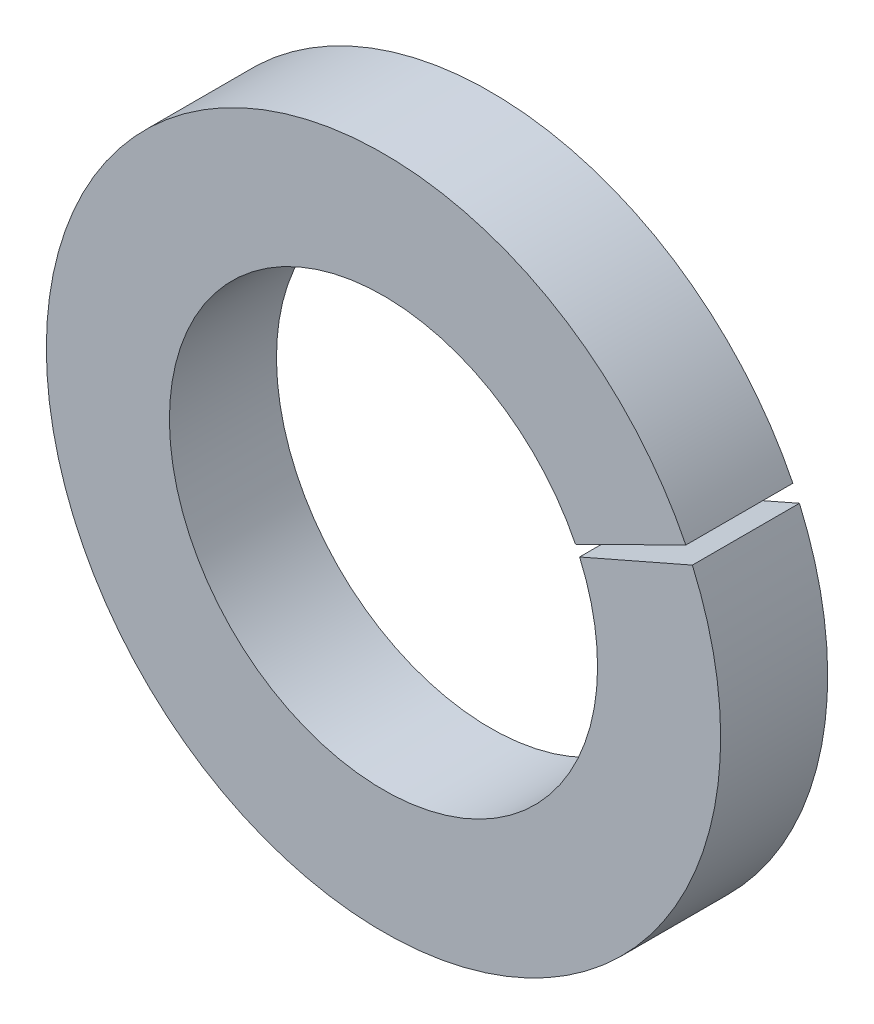
ISO-10303-21;
HEADER;
FILE_DESCRIPTION(('STEP AP214'),'2;1');
FILE_NAME('part.step','',(''),(''),'','','');
FILE_SCHEMA(('AUTOMOTIVE_DESIGN { 1 0 10303 214 1 1 1 1 }'));
ENDSEC;
DATA;
#1=APPLICATION_CONTEXT('core data for automotive mechanical design processes');
#2=APPLICATION_PROTOCOL_DEFINITION('international standard','automotive_design',2000,#1);
#3=PRODUCT_CONTEXT('',#1,'mechanical');
#4=PRODUCT('Part','Part','',(#3));
#5=PRODUCT_RELATED_PRODUCT_CATEGORY('part','',(#4));
#6=PRODUCT_DEFINITION_FORMATION('','',#4);
#7=PRODUCT_DEFINITION_CONTEXT('part definition',#1,'design');
#8=PRODUCT_DEFINITION('design','',#6,#7);
#9=PRODUCT_DEFINITION_SHAPE('','',#8);
#10=(LENGTH_UNIT() NAMED_UNIT(*) SI_UNIT(.MILLI.,.METRE.));
#11=(NAMED_UNIT(*) PLANE_ANGLE_UNIT() SI_UNIT($,.RADIAN.));
#12=(NAMED_UNIT(*) SI_UNIT($,.STERADIAN.) SOLID_ANGLE_UNIT());
#13=UNCERTAINTY_MEASURE_WITH_UNIT(LENGTH_MEASURE(1.E-05),#10,'distance_accuracy_value','');
#14=(GEOMETRIC_REPRESENTATION_CONTEXT(3) GLOBAL_UNCERTAINTY_ASSIGNED_CONTEXT((#13)) GLOBAL_UNIT_ASSIGNED_CONTEXT((#10,
#11,#12)) REPRESENTATION_CONTEXT('',''));
#15=CARTESIAN_POINT('',(0.,0.,0.));
#16=DIRECTION('',(0.,0.,1.));
#17=DIRECTION('',(1.,0.,0.));
#18=AXIS2_PLACEMENT_3D('',#15,#16,#17);
#19=CARTESIAN_POINT('',(0.,0.,1.));
#20=DIRECTION('',(0.,0.,1.));
#21=DIRECTION('',(1.,0.,0.));
#22=AXIS2_PLACEMENT_3D('',#19,#20,#21);
#23=PLANE('',#22);
#24=DIRECTION('',(0.91612800253932,0.400885872741003,0.));
#25=VECTOR('',#24,1.);
#26=CARTESIAN_POINT('',(4.81245926481222,2.10587049741662,1.));
#27=LINE('',#26,#25);
#28=CARTESIAN_POINT('',(1.83225600507864,0.801771745482005,1.));
#29=VERTEX_POINT('',#28);
#30=CARTESIAN_POINT('',(2.88580320799886,1.26279049913416,1.));
#31=VERTEX_POINT('',#30);
#32=EDGE_CURVE('E81',#29,#31,#27,.T.);
#33=ORIENTED_EDGE('',*,*,#32,.F.);
#34=CARTESIAN_POINT('',(0.,0.,1.));
#35=DIRECTION('',(0.,0.,1.));
#36=DIRECTION('',(1.,0.,0.));
#37=AXIS2_PLACEMENT_3D('',#34,#35,#36);
#38=CIRCLE('',#37,2.);
#39=CARTESIAN_POINT('',(1.79340092634827,0.88527572957421,1.));
#40=VERTEX_POINT('',#39);
#41=EDGE_CURVE('E90',#40,#29,#38,.T.);
#42=ORIENTED_EDGE('',*,*,#41,.F.);
#43=DIRECTION('',(-0.896700463174137,-0.442637864787105,0.));
#44=VECTOR('',#43,1.);
#45=CARTESIAN_POINT('',(0.,0.,1.));
#46=LINE('',#45,#44);
#47=CARTESIAN_POINT('',(2.82460645899853,1.39430927407938,1.));
#48=VERTEX_POINT('',#47);
#49=EDGE_CURVE('E64',#48,#40,#46,.T.);
#50=ORIENTED_EDGE('',*,*,#49,.F.);
#51=CARTESIAN_POINT('',(0.,0.,1.));
#52=DIRECTION('',(0.,0.,1.));
#53=DIRECTION('',(1.,0.,0.));
#54=AXIS2_PLACEMENT_3D('',#51,#52,#53);
#55=CIRCLE('',#54,3.15);
#56=EDGE_CURVE('E92',#48,#31,#55,.T.);
#57=ORIENTED_EDGE('',*,*,#56,.T.);
#58=EDGE_LOOP('',(#33,#42,#50,#57));
#59=FACE_BOUND('',#58,.T.);
#60=ADVANCED_FACE('F41',(#59),#23,.T.);
#61=CARTESIAN_POINT('',(0.,0.,0.));
#62=DIRECTION('',(0.,0.,1.));
#63=DIRECTION('',(1.,0.,0.));
#64=AXIS2_PLACEMENT_3D('',#61,#62,#63);
#65=PLANE('',#64);
#66=CARTESIAN_POINT('',(0.,0.,0.));
#67=DIRECTION('',(0.,0.,1.));
#68=DIRECTION('',(1.,0.,0.));
#69=AXIS2_PLACEMENT_3D('',#66,#67,#68);
#70=CIRCLE('',#69,2.);
#71=CARTESIAN_POINT('',(1.79340092634828,0.88527572957421,0.));
#72=VERTEX_POINT('',#71);
#73=CARTESIAN_POINT('',(1.83225600507864,0.801771745482006,0.));
#74=VERTEX_POINT('',#73);
#75=EDGE_CURVE('E98',#72,#74,#70,.T.);
#76=ORIENTED_EDGE('',*,*,#75,.T.);
#77=DIRECTION('',(0.91612800253932,0.400885872741003,0.));
#78=VECTOR('',#77,1.);
#79=CARTESIAN_POINT('',(0.,0.,0.));
#80=LINE('',#79,#78);
#81=CARTESIAN_POINT('',(2.88580320799886,1.26279049913416,0.));
#82=VERTEX_POINT('',#81);
#83=EDGE_CURVE('E56',#74,#82,#80,.T.);
#84=ORIENTED_EDGE('',*,*,#83,.T.);
#85=CARTESIAN_POINT('',(0.,0.,0.));
#86=DIRECTION('',(0.,0.,1.));
#87=DIRECTION('',(1.,0.,0.));
#88=AXIS2_PLACEMENT_3D('',#85,#86,#87);
#89=CIRCLE('',#88,3.15);
#90=CARTESIAN_POINT('',(2.82460645899853,1.39430927407938,0.));
#91=VERTEX_POINT('',#90);
#92=EDGE_CURVE('E97',#91,#82,#89,.T.);
#93=ORIENTED_EDGE('',*,*,#92,.F.);
#94=DIRECTION('',(-0.896700463174138,-0.442637864787105,0.));
#95=VECTOR('',#94,1.);
#96=CARTESIAN_POINT('',(0.,0.,0.));
#97=LINE('',#96,#95);
#98=EDGE_CURVE('E113',#91,#72,#97,.T.);
#99=ORIENTED_EDGE('',*,*,#98,.T.);
#100=EDGE_LOOP('',(#76,#84,#93,#99));
#101=FACE_BOUND('',#100,.T.);
#102=ADVANCED_FACE('F117',(#101),#65,.F.);
#103=CARTESIAN_POINT('',(0.,0.,1.));
#104=DIRECTION('',(0.,0.,-1.));
#105=DIRECTION('',(-1.,0.,0.));
#106=AXIS2_PLACEMENT_3D('',#103,#104,#105);
#107=CYLINDRICAL_SURFACE('',#106,3.15);
#108=ORIENTED_EDGE('',*,*,#92,.T.);
#109=DIRECTION('',(0.,0.,-1.));
#110=VECTOR('',#109,1.);
#111=CARTESIAN_POINT('',(2.88580320799886,1.26279049913416,1.));
#112=LINE('',#111,#110);
#113=EDGE_CURVE('E104',#82,#31,#112,.F.);
#114=ORIENTED_EDGE('',*,*,#113,.T.);
#115=ORIENTED_EDGE('',*,*,#56,.F.);
#116=DIRECTION('',(0.,0.,-1.));
#117=VECTOR('',#116,1.);
#118=CARTESIAN_POINT('',(2.82460645899853,1.39430927407938,1.));
#119=LINE('',#118,#117);
#120=EDGE_CURVE('E119',#48,#91,#119,.T.);
#121=ORIENTED_EDGE('',*,*,#120,.T.);
#122=EDGE_LOOP('',(#108,#114,#115,#121));
#123=FACE_BOUND('',#122,.T.);
#124=ADVANCED_FACE('F43',(#123),#107,.T.);
#125=CARTESIAN_POINT('',(0.,0.,1.));
#126=DIRECTION('',(0.,0.,-1.));
#127=DIRECTION('',(-1.,0.,0.));
#128=AXIS2_PLACEMENT_3D('',#125,#126,#127);
#129=CYLINDRICAL_SURFACE('',#128,2.);
#130=DIRECTION('',(0.,0.,-1.));
#131=VECTOR('',#130,1.);
#132=CARTESIAN_POINT('',(1.83225600507864,0.801771745482006,1.));
#133=LINE('',#132,#131);
#134=EDGE_CURVE('E11',#74,#29,#133,.F.);
#135=ORIENTED_EDGE('',*,*,#134,.F.);
#136=ORIENTED_EDGE('',*,*,#75,.F.);
#137=DIRECTION('',(0.,0.,-1.));
#138=VECTOR('',#137,1.);
#139=CARTESIAN_POINT('',(1.79340092634828,0.88527572957421,1.));
#140=LINE('',#139,#138);
#141=EDGE_CURVE('E50',#40,#72,#140,.T.);
#142=ORIENTED_EDGE('',*,*,#141,.F.);
#143=ORIENTED_EDGE('',*,*,#41,.T.);
#144=EDGE_LOOP('',(#135,#136,#142,#143));
#145=FACE_BOUND('',#144,.T.);
#146=ADVANCED_FACE('F95',(#145),#129,.F.);
#147=CARTESIAN_POINT('',(0.,0.,-9.));
#148=DIRECTION('',(-0.442637864787105,0.896700463174138,0.));
#149=DIRECTION('',(-0.896700463174138,-0.442637864787105,0.));
#150=AXIS2_PLACEMENT_3D('',#147,#148,#149);
#151=PLANE('',#150);
#152=ORIENTED_EDGE('',*,*,#49,.T.);
#153=ORIENTED_EDGE('',*,*,#141,.T.);
#154=ORIENTED_EDGE('',*,*,#98,.F.);
#155=ORIENTED_EDGE('',*,*,#120,.F.);
#156=EDGE_LOOP('',(#152,#153,#154,#155));
#157=FACE_BOUND('',#156,.T.);
#158=ADVANCED_FACE('F112',(#157),#151,.F.);
#159=CARTESIAN_POINT('',(4.81245926481222,2.10587049741662,-9.));
#160=DIRECTION('',(0.400885872741003,-0.91612800253932,0.));
#161=DIRECTION('',(0.91612800253932,0.400885872741003,0.));
#162=AXIS2_PLACEMENT_3D('',#159,#160,#161);
#163=PLANE('',#162);
#164=ORIENTED_EDGE('',*,*,#83,.F.);
#165=ORIENTED_EDGE('',*,*,#134,.T.);
#166=ORIENTED_EDGE('',*,*,#32,.T.);
#167=ORIENTED_EDGE('',*,*,#113,.F.);
#168=EDGE_LOOP('',(#164,#165,#166,#167));
#169=FACE_BOUND('',#168,.T.);
#170=ADVANCED_FACE('F80',(#169),#163,.F.);
#171=CLOSED_SHELL('',(#60,#102,#124,#146,#158,#170));
#172=MANIFOLD_SOLID_BREP('B2',#171);
#173=ADVANCED_BREP_SHAPE_REPRESENTATION('',(#18,#172),#14);
#174=SHAPE_DEFINITION_REPRESENTATION(#9,#173);
ENDSEC;
END-ISO-10303-21;
